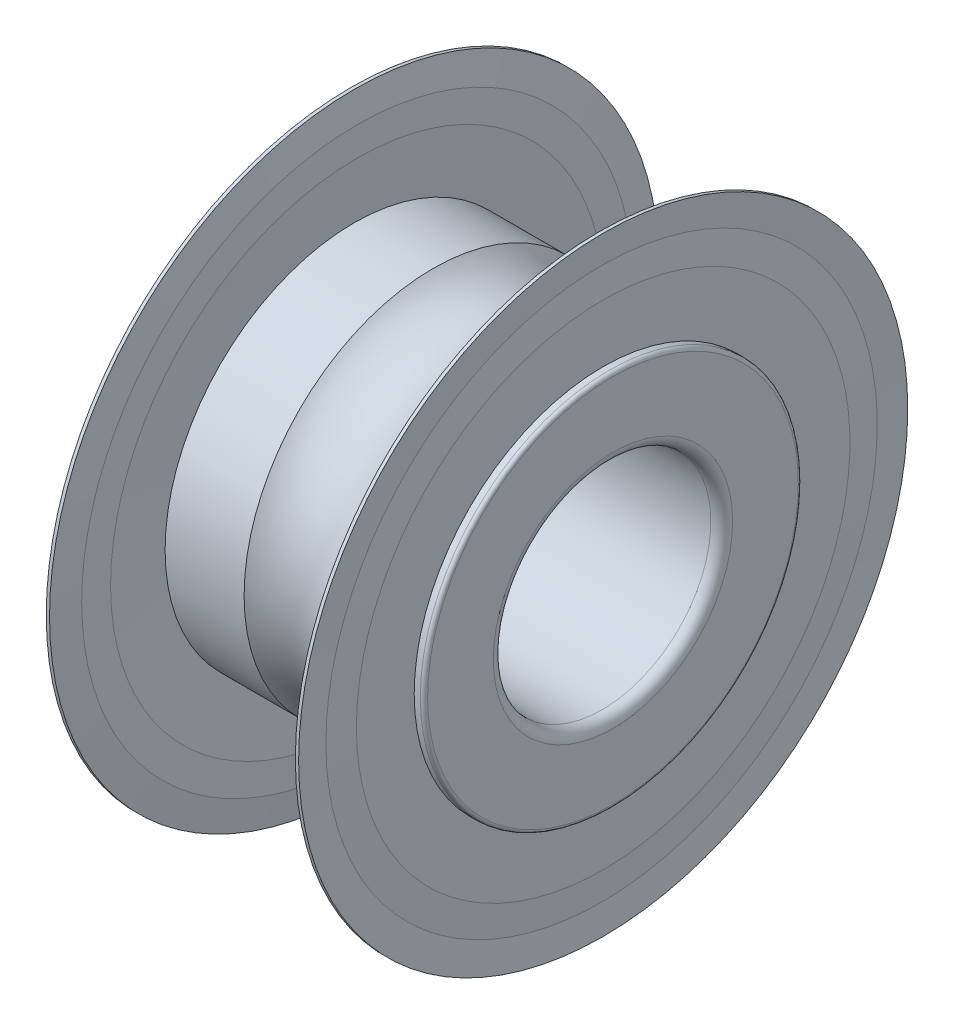
ISO-10303-21;
HEADER;
FILE_DESCRIPTION(('STEP AP214'),'2;1');
FILE_NAME('part.step','',(''),(''),'','','');
FILE_SCHEMA(('AUTOMOTIVE_DESIGN { 1 0 10303 214 1 1 1 1 }'));
ENDSEC;
DATA;
#1=APPLICATION_CONTEXT('core data for automotive mechanical design processes');
#2=APPLICATION_PROTOCOL_DEFINITION('international standard','automotive_design',2000,#1);
#3=PRODUCT_CONTEXT('',#1,'mechanical');
#4=PRODUCT('Part','Part','',(#3));
#5=PRODUCT_RELATED_PRODUCT_CATEGORY('part','',(#4));
#6=PRODUCT_DEFINITION_FORMATION('','',#4);
#7=PRODUCT_DEFINITION_CONTEXT('part definition',#1,'design');
#8=PRODUCT_DEFINITION('design','',#6,#7);
#9=PRODUCT_DEFINITION_SHAPE('','',#8);
#10=(LENGTH_UNIT() NAMED_UNIT(*) SI_UNIT(.MILLI.,.METRE.));
#11=(NAMED_UNIT(*) PLANE_ANGLE_UNIT() SI_UNIT($,.RADIAN.));
#12=(NAMED_UNIT(*) SI_UNIT($,.STERADIAN.) SOLID_ANGLE_UNIT());
#13=UNCERTAINTY_MEASURE_WITH_UNIT(LENGTH_MEASURE(1.E-05),#10,'distance_accuracy_value','');
#14=(GEOMETRIC_REPRESENTATION_CONTEXT(3) GLOBAL_UNCERTAINTY_ASSIGNED_CONTEXT((#13)) GLOBAL_UNIT_ASSIGNED_CONTEXT((#10,
#11,#12)) REPRESENTATION_CONTEXT('',''));
#15=CARTESIAN_POINT('',(0.,0.,0.));
#16=DIRECTION('',(0.,0.,1.));
#17=DIRECTION('',(1.,0.,0.));
#18=AXIS2_PLACEMENT_3D('',#15,#16,#17);
#19=CARTESIAN_POINT('',(0.,-3.40833333333333,-3.40833333333331));
#20=DIRECTION('',(-1.,0.,0.));
#21=DIRECTION('',(0.,0.,1.));
#22=AXIS2_PLACEMENT_3D('',#19,#20,#21);
#23=PLANE('',#22);
#24=CARTESIAN_POINT('',(0.,0.,0.));
#25=DIRECTION('',(-1.,0.,0.));
#26=DIRECTION('',(0.,0.,-1.));
#27=AXIS2_PLACEMENT_3D('',#24,#25,#26);
#28=CIRCLE('',#27,3.40833333691506);
#29=CARTESIAN_POINT('',(0.,0.,-3.40833333691506));
#30=VERTEX_POINT('',#29);
#31=EDGE_CURVE('E98',#30,#30,#28,.F.);
#32=ORIENTED_EDGE('',*,*,#31,.F.);
#33=EDGE_LOOP('',(#32));
#34=FACE_BOUND('',#33,.T.);
#35=CARTESIAN_POINT('',(0.,0.,0.));
#36=DIRECTION('',(1.,0.,0.));
#37=DIRECTION('',(0.,0.,1.));
#38=AXIS2_PLACEMENT_3D('',#35,#36,#37);
#39=CIRCLE('',#38,2.2);
#40=CARTESIAN_POINT('',(0.,0.,2.2));
#41=VERTEX_POINT('',#40);
#42=EDGE_CURVE('E95',#41,#41,#39,.T.);
#43=ORIENTED_EDGE('',*,*,#42,.T.);
#44=EDGE_LOOP('',(#43));
#45=FACE_BOUND('',#44,.T.);
#46=ADVANCED_FACE('F15',(#34,#45),#23,.T.);
#47=CARTESIAN_POINT('',(5.,-3.4083333333333,3.4083333333333));
#48=DIRECTION('',(1.,0.,0.));
#49=DIRECTION('',(0.,0.,-1.));
#50=AXIS2_PLACEMENT_3D('',#47,#48,#49);
#51=PLANE('',#50);
#52=CARTESIAN_POINT('',(5.,0.,0.));
#53=DIRECTION('',(1.,0.,0.));
#54=DIRECTION('',(0.,0.,1.));
#55=AXIS2_PLACEMENT_3D('',#52,#53,#54);
#56=CIRCLE('',#55,3.40833334658696);
#57=CARTESIAN_POINT('',(5.,0.,3.40833334658696));
#58=VERTEX_POINT('',#57);
#59=EDGE_CURVE('E92',#58,#58,#56,.T.);
#60=ORIENTED_EDGE('',*,*,#59,.T.);
#61=EDGE_LOOP('',(#60));
#62=FACE_BOUND('',#61,.T.);
#63=CARTESIAN_POINT('',(5.,0.,0.));
#64=DIRECTION('',(-1.,0.,0.));
#65=DIRECTION('',(0.,0.,-1.));
#66=AXIS2_PLACEMENT_3D('',#63,#64,#65);
#67=CIRCLE('',#66,2.20000011194733);
#68=CARTESIAN_POINT('',(5.,0.,-2.20000011194733));
#69=VERTEX_POINT('',#68);
#70=EDGE_CURVE('E89',#69,#69,#67,.F.);
#71=ORIENTED_EDGE('',*,*,#70,.F.);
#72=EDGE_LOOP('',(#71));
#73=FACE_BOUND('',#72,.T.);
#74=ADVANCED_FACE('F107',(#62,#73),#51,.T.);
#75=CARTESIAN_POINT('',(0.18,-4.53750000000003,-4.53750000000001));
#76=DIRECTION('',(-1.,0.,0.));
#77=DIRECTION('',(0.,0.,1.));
#78=AXIS2_PLACEMENT_3D('',#75,#76,#77);
#79=PLANE('',#78);
#80=CARTESIAN_POINT('',(0.18,0.,0.));
#81=DIRECTION('',(-1.,0.,0.));
#82=DIRECTION('',(0.,0.,-1.));
#83=AXIS2_PLACEMENT_3D('',#80,#81,#82);
#84=CIRCLE('',#83,4.53750000000004);
#85=CARTESIAN_POINT('',(0.18,0.,-4.53750000000004));
#86=VERTEX_POINT('',#85);
#87=EDGE_CURVE('E86',#86,#86,#84,.F.);
#88=ORIENTED_EDGE('',*,*,#87,.F.);
#89=EDGE_LOOP('',(#88));
#90=FACE_BOUND('',#89,.T.);
#91=CARTESIAN_POINT('',(0.18,0.,0.));
#92=DIRECTION('',(1.,0.,0.));
#93=DIRECTION('',(0.,0.,1.));
#94=AXIS2_PLACEMENT_3D('',#91,#92,#93);
#95=CIRCLE('',#94,3.475);
#96=CARTESIAN_POINT('',(0.18,0.,3.475));
#97=VERTEX_POINT('',#96);
#98=EDGE_CURVE('E83',#97,#97,#95,.T.);
#99=ORIENTED_EDGE('',*,*,#98,.T.);
#100=EDGE_LOOP('',(#99));
#101=FACE_BOUND('',#100,.T.);
#102=ADVANCED_FACE('F204',(#90,#101),#79,.T.);
#103=CARTESIAN_POINT('',(0.3,-5.06874975516978,5.06875038792058));
#104=DIRECTION('',(1.,0.,0.));
#105=DIRECTION('',(0.,0.,-1.));
#106=AXIS2_PLACEMENT_3D('',#103,#104,#105);
#107=PLANE('',#106);
#108=CARTESIAN_POINT('',(0.3,0.,0.));
#109=DIRECTION('',(1.,0.,0.));
#110=DIRECTION('',(0.,-1.41610154604074E-07,0.99999999999999));
#111=AXIS2_PLACEMENT_3D('',#108,#109,#110);
#112=CIRCLE('',#111,5.06875);
#113=CARTESIAN_POINT('',(0.3,-7.17786471149402E-07,5.06874999999995));
#114=VERTEX_POINT('',#113);
#115=EDGE_CURVE('E80',#114,#114,#112,.T.);
#116=ORIENTED_EDGE('',*,*,#115,.T.);
#117=EDGE_LOOP('',(#116));
#118=FACE_BOUND('',#117,.T.);
#119=CARTESIAN_POINT('',(0.3,0.,0.));
#120=DIRECTION('',(-1.,0.,0.));
#121=DIRECTION('',(0.,0.,-1.));
#122=AXIS2_PLACEMENT_3D('',#119,#120,#121);
#123=CIRCLE('',#122,4.53749999999997);
#124=CARTESIAN_POINT('',(0.3,0.,-4.53749999999997));
#125=VERTEX_POINT('',#124);
#126=EDGE_CURVE('E77',#125,#125,#123,.F.);
#127=ORIENTED_EDGE('',*,*,#126,.F.);
#128=EDGE_LOOP('',(#127));
#129=FACE_BOUND('',#128,.T.);
#130=ADVANCED_FACE('F193',(#118,#129),#107,.T.);
#131=CARTESIAN_POINT('',(4.7,-5.06875000000004,-5.06875000000001));
#132=DIRECTION('',(-1.,0.,0.));
#133=DIRECTION('',(0.,0.,1.));
#134=AXIS2_PLACEMENT_3D('',#131,#132,#133);
#135=PLANE('',#134);
#136=CARTESIAN_POINT('',(4.7,0.,0.));
#137=DIRECTION('',(-1.,0.,0.));
#138=DIRECTION('',(0.,0.,-1.));
#139=AXIS2_PLACEMENT_3D('',#136,#137,#138);
#140=CIRCLE('',#139,5.06874999999997);
#141=CARTESIAN_POINT('',(4.7,0.,-5.06874999999997));
#142=VERTEX_POINT('',#141);
#143=EDGE_CURVE('E74',#142,#142,#140,.F.);
#144=ORIENTED_EDGE('',*,*,#143,.F.);
#145=EDGE_LOOP('',(#144));
#146=FACE_BOUND('',#145,.T.);
#147=CARTESIAN_POINT('',(4.7,0.,0.));
#148=DIRECTION('',(1.,0.,0.));
#149=DIRECTION('',(0.,0.,1.));
#150=AXIS2_PLACEMENT_3D('',#147,#148,#149);
#151=CIRCLE('',#150,4.5375);
#152=CARTESIAN_POINT('',(4.7,0.,4.5375));
#153=VERTEX_POINT('',#152);
#154=EDGE_CURVE('E71',#153,#153,#151,.T.);
#155=ORIENTED_EDGE('',*,*,#154,.T.);
#156=EDGE_LOOP('',(#155));
#157=FACE_BOUND('',#156,.T.);
#158=ADVANCED_FACE('F189',(#146,#157),#135,.T.);
#159=CARTESIAN_POINT('',(4.82,-4.5375,4.5375));
#160=DIRECTION('',(1.,0.,0.));
#161=DIRECTION('',(0.,0.,-1.));
#162=AXIS2_PLACEMENT_3D('',#159,#160,#161);
#163=PLANE('',#162);
#164=CARTESIAN_POINT('',(4.82,0.,0.));
#165=DIRECTION('',(1.,0.,0.));
#166=DIRECTION('',(0.,0.,1.));
#167=AXIS2_PLACEMENT_3D('',#164,#165,#166);
#168=CIRCLE('',#167,4.5375);
#169=CARTESIAN_POINT('',(4.82,0.,4.5375));
#170=VERTEX_POINT('',#169);
#171=EDGE_CURVE('E68',#170,#170,#168,.T.);
#172=ORIENTED_EDGE('',*,*,#171,.T.);
#173=EDGE_LOOP('',(#172));
#174=FACE_BOUND('',#173,.T.);
#175=CARTESIAN_POINT('',(4.82,0.,0.));
#176=DIRECTION('',(-1.,0.,0.));
#177=DIRECTION('',(0.,0.,-1.));
#178=AXIS2_PLACEMENT_3D('',#175,#176,#177);
#179=CIRCLE('',#178,3.475);
#180=CARTESIAN_POINT('',(4.82,0.,-3.475));
#181=VERTEX_POINT('',#180);
#182=EDGE_CURVE('E65',#181,#181,#179,.F.);
#183=ORIENTED_EDGE('',*,*,#182,.F.);
#184=EDGE_LOOP('',(#183));
#185=FACE_BOUND('',#184,.T.);
#186=ADVANCED_FACE('F192',(#174,#185),#163,.T.);
#187=CARTESIAN_POINT('',(50.,0.,0.));
#188=DIRECTION('',(1.,0.,0.));
#189=DIRECTION('',(0.,0.,1.));
#190=AXIS2_PLACEMENT_3D('',#187,#188,#189);
#191=CYLINDRICAL_SURFACE('',#190,3.475);
#192=CARTESIAN_POINT('',(3.3072578584319,0.,0.));
#193=DIRECTION('',(1.,0.,0.));
#194=DIRECTION('',(0.,0.,1.));
#195=AXIS2_PLACEMENT_3D('',#192,#193,#194);
#196=CIRCLE('',#195,3.475);
#197=CARTESIAN_POINT('',(3.3072578584319,0.,3.475));
#198=VERTEX_POINT('',#197);
#199=EDGE_CURVE('E62',#198,#198,#196,.T.);
#200=ORIENTED_EDGE('',*,*,#199,.T.);
#201=EDGE_LOOP('',(#200));
#202=FACE_BOUND('',#201,.T.);
#203=CARTESIAN_POINT('',(4.76,0.,0.));
#204=DIRECTION('',(-1.,0.,0.));
#205=DIRECTION('',(0.,0.,-1.));
#206=AXIS2_PLACEMENT_3D('',#203,#204,#205);
#207=CIRCLE('',#206,3.475);
#208=CARTESIAN_POINT('',(4.76,0.,-3.475));
#209=VERTEX_POINT('',#208);
#210=EDGE_CURVE('E59',#209,#209,#207,.F.);
#211=ORIENTED_EDGE('',*,*,#210,.F.);
#212=EDGE_LOOP('',(#211));
#213=FACE_BOUND('',#212,.T.);
#214=ADVANCED_FACE('F201',(#202,#213),#191,.T.);
#215=CARTESIAN_POINT('',(50.,0.,0.));
#216=DIRECTION('',(1.,0.,0.));
#217=DIRECTION('',(0.,0.,1.));
#218=AXIS2_PLACEMENT_3D('',#215,#216,#217);
#219=CYLINDRICAL_SURFACE('',#218,3.475);
#220=CARTESIAN_POINT('',(0.0666666666666629,0.,0.));
#221=DIRECTION('',(1.,0.,0.));
#222=DIRECTION('',(0.,0.,1.));
#223=AXIS2_PLACEMENT_3D('',#220,#221,#222);
#224=CIRCLE('',#223,3.475);
#225=CARTESIAN_POINT('',(0.0666666666666629,0.,3.475));
#226=VERTEX_POINT('',#225);
#227=EDGE_CURVE('E56',#226,#226,#224,.T.);
#228=ORIENTED_EDGE('',*,*,#227,.T.);
#229=EDGE_LOOP('',(#228));
#230=FACE_BOUND('',#229,.T.);
#231=ORIENTED_EDGE('',*,*,#98,.F.);
#232=EDGE_LOOP('',(#231));
#233=FACE_BOUND('',#232,.T.);
#234=ADVANCED_FACE('F124',(#230,#233),#219,.T.);
#235=CARTESIAN_POINT('',(0.0666666666667299,0.,0.));
#236=DIRECTION('',(1.,0.,0.));
#237=DIRECTION('',(0.,1.41924983887771E-07,0.99999999999999));
#238=AXIS2_PLACEMENT_3D('',#235,#236,#237);
#239=TOROIDAL_SURFACE('',#238,3.40833333333327,0.06666666666673);
#240=ORIENTED_EDGE('',*,*,#31,.T.);
#241=EDGE_LOOP('',(#240));
#242=FACE_BOUND('',#241,.T.);
#243=ORIENTED_EDGE('',*,*,#227,.F.);
#244=EDGE_LOOP('',(#243));
#245=FACE_BOUND('',#244,.T.);
#246=ADVANCED_FACE('F102',(#242,#245),#239,.T.);
#247=CARTESIAN_POINT('',(0.200000000000017,0.,0.));
#248=DIRECTION('',(1.,0.,0.));
#249=DIRECTION('',(0.,0.,1.));
#250=AXIS2_PLACEMENT_3D('',#247,#248,#249);
#251=TOROIDAL_SURFACE('',#250,2.2,0.200000000000017);
#252=CARTESIAN_POINT('',(0.2,0.,0.));
#253=DIRECTION('',(1.,0.,0.));
#254=DIRECTION('',(0.,0.,1.));
#255=AXIS2_PLACEMENT_3D('',#252,#253,#254);
#256=CIRCLE('',#255,1.99999999999998);
#257=CARTESIAN_POINT('',(0.2,0.,1.99999999999998));
#258=VERTEX_POINT('',#257);
#259=EDGE_CURVE('E53',#258,#258,#256,.T.);
#260=ORIENTED_EDGE('',*,*,#259,.T.);
#261=EDGE_LOOP('',(#260));
#262=FACE_BOUND('',#261,.T.);
#263=ORIENTED_EDGE('',*,*,#42,.F.);
#264=EDGE_LOOP('',(#263));
#265=FACE_BOUND('',#264,.T.);
#266=ADVANCED_FACE('F111',(#262,#265),#251,.T.);
#267=CARTESIAN_POINT('',(50.,0.,0.));
#268=DIRECTION('',(1.,0.,0.));
#269=DIRECTION('',(0.,0.,1.));
#270=AXIS2_PLACEMENT_3D('',#267,#268,#269);
#271=CYLINDRICAL_SURFACE('',#270,2.);
#272=CARTESIAN_POINT('',(4.8,0.,0.));
#273=DIRECTION('',(1.,0.,0.));
#274=DIRECTION('',(0.,0.,1.));
#275=AXIS2_PLACEMENT_3D('',#272,#273,#274);
#276=CIRCLE('',#275,2.);
#277=CARTESIAN_POINT('',(4.8,0.,2.));
#278=VERTEX_POINT('',#277);
#279=EDGE_CURVE('E50',#278,#278,#276,.T.);
#280=ORIENTED_EDGE('',*,*,#279,.T.);
#281=EDGE_LOOP('',(#280));
#282=FACE_BOUND('',#281,.T.);
#283=ORIENTED_EDGE('',*,*,#259,.F.);
#284=EDGE_LOOP('',(#283));
#285=FACE_BOUND('',#284,.T.);
#286=ADVANCED_FACE('F113',(#282,#285),#271,.F.);
#287=CARTESIAN_POINT('',(4.8,0.,0.));
#288=DIRECTION('',(1.,0.,0.));
#289=DIRECTION('',(0.,0.,1.));
#290=AXIS2_PLACEMENT_3D('',#287,#288,#289);
#291=TOROIDAL_SURFACE('',#290,2.20000000000003,0.200000000000032);
#292=ORIENTED_EDGE('',*,*,#70,.T.);
#293=EDGE_LOOP('',(#292));
#294=FACE_BOUND('',#293,.T.);
#295=ORIENTED_EDGE('',*,*,#279,.F.);
#296=EDGE_LOOP('',(#295));
#297=FACE_BOUND('',#296,.T.);
#298=ADVANCED_FACE('F121',(#294,#297),#291,.T.);
#299=CARTESIAN_POINT('',(4.93333333333321,0.,0.));
#300=DIRECTION('',(1.,0.,0.));
#301=DIRECTION('',(0.,0.,1.));
#302=AXIS2_PLACEMENT_3D('',#299,#300,#301);
#303=TOROIDAL_SURFACE('',#302,3.40833333333321,0.0666666666667912);
#304=CARTESIAN_POINT('',(4.93333333333321,0.,0.));
#305=DIRECTION('',(1.,0.,0.));
#306=DIRECTION('',(0.,0.,1.));
#307=AXIS2_PLACEMENT_3D('',#304,#305,#306);
#308=CIRCLE('',#307,3.475);
#309=CARTESIAN_POINT('',(4.93333333333321,0.,3.475));
#310=VERTEX_POINT('',#309);
#311=EDGE_CURVE('E47',#310,#310,#308,.T.);
#312=ORIENTED_EDGE('',*,*,#311,.T.);
#313=EDGE_LOOP('',(#312));
#314=FACE_BOUND('',#313,.T.);
#315=ORIENTED_EDGE('',*,*,#59,.F.);
#316=EDGE_LOOP('',(#315));
#317=FACE_BOUND('',#316,.T.);
#318=ADVANCED_FACE('F130',(#314,#317),#303,.T.);
#319=CARTESIAN_POINT('',(50.,0.,0.));
#320=DIRECTION('',(1.,0.,0.));
#321=DIRECTION('',(0.,1.42053902985391E-07,0.99999999999999));
#322=AXIS2_PLACEMENT_3D('',#319,#320,#321);
#323=CYLINDRICAL_SURFACE('',#322,3.475);
#324=ORIENTED_EDGE('',*,*,#182,.T.);
#325=EDGE_LOOP('',(#324));
#326=FACE_BOUND('',#325,.T.);
#327=ORIENTED_EDGE('',*,*,#311,.F.);
#328=EDGE_LOOP('',(#327));
#329=FACE_BOUND('',#328,.T.);
#330=ADVANCED_FACE('F134',(#326,#329),#323,.T.);
#331=CARTESIAN_POINT('',(2.5,0.,0.));
#332=DIRECTION('',(1.,0.,0.));
#333=DIRECTION('',(0.,0.,1.));
#334=AXIS2_PLACEMENT_3D('',#331,#332,#333);
#335=TOROIDAL_SURFACE('',#334,4.35000000000009,1.19050000000009);
#336=ORIENTED_EDGE('',*,*,#199,.F.);
#337=EDGE_LOOP('',(#336));
#338=FACE_BOUND('',#337,.T.);
#339=CARTESIAN_POINT('',(1.6927421415681,0.,0.));
#340=DIRECTION('',(1.,0.,0.));
#341=DIRECTION('',(0.,0.,1.));
#342=AXIS2_PLACEMENT_3D('',#339,#340,#341);
#343=CIRCLE('',#342,3.475);
#344=CARTESIAN_POINT('',(1.6927421415681,0.,3.475));
#345=VERTEX_POINT('',#344);
#346=EDGE_CURVE('E44',#345,#345,#343,.T.);
#347=ORIENTED_EDGE('',*,*,#346,.T.);
#348=EDGE_LOOP('',(#347));
#349=FACE_BOUND('',#348,.T.);
#350=ADVANCED_FACE('F138',(#338,#349),#335,.F.);
#351=CARTESIAN_POINT('',(50.,0.,0.));
#352=DIRECTION('',(1.,0.,0.));
#353=DIRECTION('',(0.,0.,1.));
#354=AXIS2_PLACEMENT_3D('',#351,#352,#353);
#355=CYLINDRICAL_SURFACE('',#354,3.475);
#356=CARTESIAN_POINT('',(0.239999999999995,0.,0.));
#357=DIRECTION('',(1.,0.,0.));
#358=DIRECTION('',(0.,0.,1.));
#359=AXIS2_PLACEMENT_3D('',#356,#357,#358);
#360=CIRCLE('',#359,3.475);
#361=CARTESIAN_POINT('',(0.239999999999995,0.,3.475));
#362=VERTEX_POINT('',#361);
#363=EDGE_CURVE('E41',#362,#362,#360,.T.);
#364=ORIENTED_EDGE('',*,*,#363,.T.);
#365=EDGE_LOOP('',(#364));
#366=FACE_BOUND('',#365,.T.);
#367=ORIENTED_EDGE('',*,*,#346,.F.);
#368=EDGE_LOOP('',(#367));
#369=FACE_BOUND('',#368,.T.);
#370=ADVANCED_FACE('F142',(#366,#369),#355,.T.);
#371=CARTESIAN_POINT('',(50.,0.,0.));
#372=DIRECTION('',(1.,0.,0.));
#373=DIRECTION('',(0.,1.92350258283877E-10,1.));
#374=AXIS2_PLACEMENT_3D('',#371,#372,#373);
#375=CYLINDRICAL_SURFACE('',#374,5.6);
#376=CARTESIAN_POINT('',(0.18,0.,0.));
#377=DIRECTION('',(1.,0.,0.));
#378=DIRECTION('',(0.,0.,1.));
#379=AXIS2_PLACEMENT_3D('',#376,#377,#378);
#380=CIRCLE('',#379,5.6);
#381=CARTESIAN_POINT('',(0.18,0.,5.6));
#382=VERTEX_POINT('',#381);
#383=EDGE_CURVE('E38',#382,#382,#380,.T.);
#384=ORIENTED_EDGE('',*,*,#383,.T.);
#385=EDGE_LOOP('',(#384));
#386=FACE_BOUND('',#385,.T.);
#387=CARTESIAN_POINT('',(0.239999999999995,0.,0.));
#388=DIRECTION('',(-1.,0.,0.));
#389=DIRECTION('',(0.,0.,-1.));
#390=AXIS2_PLACEMENT_3D('',#387,#388,#389);
#391=CIRCLE('',#390,5.6);
#392=CARTESIAN_POINT('',(0.239999999999995,0.,-5.6));
#393=VERTEX_POINT('',#392);
#394=EDGE_CURVE('E35',#393,#393,#391,.F.);
#395=ORIENTED_EDGE('',*,*,#394,.F.);
#396=EDGE_LOOP('',(#395));
#397=FACE_BOUND('',#396,.T.);
#398=ADVANCED_FACE('F146',(#386,#397),#375,.T.);
#399=CARTESIAN_POINT('',(0.18,0.,0.));
#400=DIRECTION('',(-1.,0.,0.));
#401=DIRECTION('',(0.,0.,-1.));
#402=AXIS2_PLACEMENT_3D('',#399,#400,#401);
#403=CONICAL_SURFACE('',#402,5.6,1.51438565083527);
#404=ORIENTED_EDGE('',*,*,#383,.F.);
#405=EDGE_LOOP('',(#404));
#406=FACE_BOUND('',#405,.T.);
#407=CARTESIAN_POINT('',(0.210000000000002,0.,0.));
#408=DIRECTION('',(1.,0.,0.));
#409=DIRECTION('',(0.,0.,1.));
#410=AXIS2_PLACEMENT_3D('',#407,#408,#409);
#411=CIRCLE('',#410,5.06875);
#412=CARTESIAN_POINT('',(0.210000000000002,0.,5.06875));
#413=VERTEX_POINT('',#412);
#414=EDGE_CURVE('E30',#413,#413,#411,.T.);
#415=ORIENTED_EDGE('',*,*,#414,.T.);
#416=EDGE_LOOP('',(#415));
#417=FACE_BOUND('',#416,.T.);
#418=ADVANCED_FACE('F150',(#406,#417),#403,.F.);
#419=CARTESIAN_POINT('',(0.21,0.,0.));
#420=DIRECTION('',(1.,0.,0.));
#421=DIRECTION('',(0.,1.41721887681252E-07,0.99999999999999));
#422=AXIS2_PLACEMENT_3D('',#419,#420,#421);
#423=CONICAL_SURFACE('',#422,5.06875,1.51438565083527);
#424=ORIENTED_EDGE('',*,*,#87,.T.);
#425=EDGE_LOOP('',(#424));
#426=FACE_BOUND('',#425,.T.);
#427=ORIENTED_EDGE('',*,*,#414,.F.);
#428=EDGE_LOOP('',(#427));
#429=FACE_BOUND('',#428,.T.);
#430=ADVANCED_FACE('F154',(#426,#429),#423,.T.);
#431=CARTESIAN_POINT('',(0.300000000000001,0.,0.));
#432=DIRECTION('',(1.,0.,0.));
#433=DIRECTION('',(0.,1.41558288324968E-07,0.99999999999999));
#434=AXIS2_PLACEMENT_3D('',#431,#432,#433);
#435=CONICAL_SURFACE('',#434,4.5375,1.51438565083527);
#436=ORIENTED_EDGE('',*,*,#126,.T.);
#437=EDGE_LOOP('',(#436));
#438=FACE_BOUND('',#437,.T.);
#439=ORIENTED_EDGE('',*,*,#363,.F.);
#440=EDGE_LOOP('',(#439));
#441=FACE_BOUND('',#440,.T.);
#442=ADVANCED_FACE('F158',(#438,#441),#435,.F.);
#443=CARTESIAN_POINT('',(0.239999999999996,0.,0.));
#444=DIRECTION('',(-1.,0.,0.));
#445=DIRECTION('',(0.,0.,-1.));
#446=AXIS2_PLACEMENT_3D('',#443,#444,#445);
#447=CONICAL_SURFACE('',#446,5.6,1.45833172313252);
#448=ORIENTED_EDGE('',*,*,#394,.T.);
#449=EDGE_LOOP('',(#448));
#450=FACE_BOUND('',#449,.T.);
#451=ORIENTED_EDGE('',*,*,#115,.F.);
#452=EDGE_LOOP('',(#451));
#453=FACE_BOUND('',#452,.T.);
#454=ADVANCED_FACE('F162',(#450,#453),#447,.T.);
#455=CARTESIAN_POINT('',(4.7,0.,0.));
#456=DIRECTION('',(-1.,0.,0.));
#457=DIRECTION('',(0.,0.,-1.));
#458=AXIS2_PLACEMENT_3D('',#455,#456,#457);
#459=CONICAL_SURFACE('',#458,4.5375,1.51438565083527);
#460=ORIENTED_EDGE('',*,*,#210,.T.);
#461=EDGE_LOOP('',(#460));
#462=FACE_BOUND('',#461,.T.);
#463=ORIENTED_EDGE('',*,*,#154,.F.);
#464=EDGE_LOOP('',(#463));
#465=FACE_BOUND('',#464,.T.);
#466=ADVANCED_FACE('F166',(#462,#465),#459,.F.);
#467=CARTESIAN_POINT('',(4.79,0.,0.));
#468=DIRECTION('',(-1.,0.,0.));
#469=DIRECTION('',(0.,0.,-1.));
#470=AXIS2_PLACEMENT_3D('',#467,#468,#469);
#471=CONICAL_SURFACE('',#470,5.06874999999999,1.51438565083528);
#472=ORIENTED_EDGE('',*,*,#171,.F.);
#473=EDGE_LOOP('',(#472));
#474=FACE_BOUND('',#473,.T.);
#475=CARTESIAN_POINT('',(4.79,0.,0.));
#476=DIRECTION('',(1.,0.,0.));
#477=DIRECTION('',(0.,0.,1.));
#478=AXIS2_PLACEMENT_3D('',#475,#476,#477);
#479=CIRCLE('',#478,5.06874999999999);
#480=CARTESIAN_POINT('',(4.79,0.,5.06874999999999));
#481=VERTEX_POINT('',#480);
#482=EDGE_CURVE('E26',#481,#481,#479,.T.);
#483=ORIENTED_EDGE('',*,*,#482,.T.);
#484=EDGE_LOOP('',(#483));
#485=FACE_BOUND('',#484,.T.);
#486=ADVANCED_FACE('F170',(#474,#485),#471,.T.);
#487=CARTESIAN_POINT('',(4.81999999999999,0.,0.));
#488=DIRECTION('',(1.,0.,0.));
#489=DIRECTION('',(0.,0.,1.));
#490=AXIS2_PLACEMENT_3D('',#487,#488,#489);
#491=CONICAL_SURFACE('',#490,5.59999999999999,1.51438565083528);
#492=CARTESIAN_POINT('',(4.81999999999999,0.,0.));
#493=DIRECTION('',(1.,0.,0.));
#494=DIRECTION('',(0.,0.,1.));
#495=AXIS2_PLACEMENT_3D('',#492,#493,#494);
#496=CIRCLE('',#495,5.59999999999999);
#497=CARTESIAN_POINT('',(4.81999999999999,0.,5.59999999999999));
#498=VERTEX_POINT('',#497);
#499=EDGE_CURVE('E22',#498,#498,#496,.T.);
#500=ORIENTED_EDGE('',*,*,#499,.T.);
#501=EDGE_LOOP('',(#500));
#502=FACE_BOUND('',#501,.T.);
#503=ORIENTED_EDGE('',*,*,#482,.F.);
#504=EDGE_LOOP('',(#503));
#505=FACE_BOUND('',#504,.T.);
#506=ADVANCED_FACE('F174',(#502,#505),#491,.F.);
#507=CARTESIAN_POINT('',(50.,0.,0.));
#508=DIRECTION('',(1.,0.,0.));
#509=DIRECTION('',(0.,0.,1.));
#510=AXIS2_PLACEMENT_3D('',#507,#508,#509);
#511=CYLINDRICAL_SURFACE('',#510,5.6);
#512=CARTESIAN_POINT('',(4.76,0.,0.));
#513=DIRECTION('',(1.,0.,0.));
#514=DIRECTION('',(0.,0.,1.));
#515=AXIS2_PLACEMENT_3D('',#512,#513,#514);
#516=CIRCLE('',#515,5.6);
#517=CARTESIAN_POINT('',(4.76,0.,5.6));
#518=VERTEX_POINT('',#517);
#519=EDGE_CURVE('E10',#518,#518,#516,.T.);
#520=ORIENTED_EDGE('',*,*,#519,.T.);
#521=EDGE_LOOP('',(#520));
#522=FACE_BOUND('',#521,.T.);
#523=ORIENTED_EDGE('',*,*,#499,.F.);
#524=EDGE_LOOP('',(#523));
#525=FACE_BOUND('',#524,.T.);
#526=ADVANCED_FACE('F177',(#522,#525),#511,.T.);
#527=CARTESIAN_POINT('',(4.76,0.,0.));
#528=DIRECTION('',(1.,0.,0.));
#529=DIRECTION('',(0.,1.41721869917684E-07,0.99999999999999));
#530=AXIS2_PLACEMENT_3D('',#527,#528,#529);
#531=CONICAL_SURFACE('',#530,5.6,1.45833172313253);
#532=ORIENTED_EDGE('',*,*,#143,.T.);
#533=EDGE_LOOP('',(#532));
#534=FACE_BOUND('',#533,.T.);
#535=ORIENTED_EDGE('',*,*,#519,.F.);
#536=EDGE_LOOP('',(#535));
#537=FACE_BOUND('',#536,.T.);
#538=ADVANCED_FACE('F17',(#534,#537),#531,.T.);
#539=CLOSED_SHELL('',(#46,#74,#102,#130,#158,#186,#214,#234,#246,#266,#286,#298,#318,#330,#350,
#370,#398,#418,#430,#442,#454,#466,#486,#506,#526,#538));
#540=MANIFOLD_SOLID_BREP('B1',#539);
#541=ADVANCED_BREP_SHAPE_REPRESENTATION('',(#18,#540),#14);
#542=SHAPE_DEFINITION_REPRESENTATION(#9,#541);
ENDSEC;
END-ISO-10303-21;
